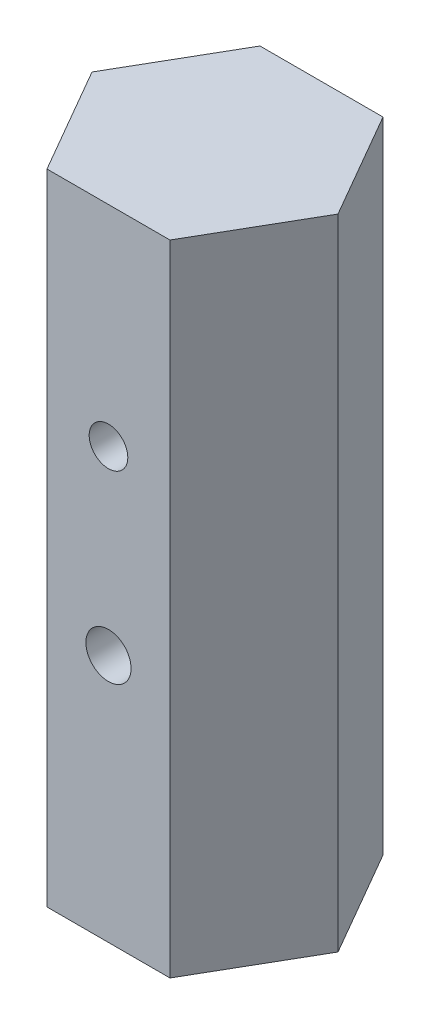
ISO-10303-21;
HEADER;
FILE_DESCRIPTION(('STEP AP214'),'2;1');
FILE_NAME('part.step','',(''),(''),'','','');
FILE_SCHEMA(('AUTOMOTIVE_DESIGN { 1 0 10303 214 1 1 1 1 }'));
ENDSEC;
DATA;
#1=APPLICATION_CONTEXT('core data for automotive mechanical design processes');
#2=APPLICATION_PROTOCOL_DEFINITION('international standard','automotive_design',2000,#1);
#3=PRODUCT_CONTEXT('',#1,'mechanical');
#4=PRODUCT('Part','Part','',(#3));
#5=PRODUCT_RELATED_PRODUCT_CATEGORY('part','',(#4));
#6=PRODUCT_DEFINITION_FORMATION('','',#4);
#7=PRODUCT_DEFINITION_CONTEXT('part definition',#1,'design');
#8=PRODUCT_DEFINITION('design','',#6,#7);
#9=PRODUCT_DEFINITION_SHAPE('','',#8);
#10=(LENGTH_UNIT() NAMED_UNIT(*) SI_UNIT(.MILLI.,.METRE.));
#11=(NAMED_UNIT(*) PLANE_ANGLE_UNIT() SI_UNIT($,.RADIAN.));
#12=(NAMED_UNIT(*) SI_UNIT($,.STERADIAN.) SOLID_ANGLE_UNIT());
#13=UNCERTAINTY_MEASURE_WITH_UNIT(LENGTH_MEASURE(1.E-05),#10,'distance_accuracy_value','');
#14=(GEOMETRIC_REPRESENTATION_CONTEXT(3) GLOBAL_UNCERTAINTY_ASSIGNED_CONTEXT((#13)) GLOBAL_UNIT_ASSIGNED_CONTEXT((#10,
#11,#12)) REPRESENTATION_CONTEXT('',''));
#15=CARTESIAN_POINT('',(0.,0.,0.));
#16=DIRECTION('',(0.,0.,1.));
#17=DIRECTION('',(1.,0.,0.));
#18=AXIS2_PLACEMENT_3D('',#15,#16,#17);
#19=CARTESIAN_POINT('',(-5.49926131403119,57.15,9.525));
#20=DIRECTION('',(0.,0.,-1.));
#21=DIRECTION('',(-1.,0.,0.));
#22=AXIS2_PLACEMENT_3D('',#19,#20,#21);
#23=PLANE('',#22);
#24=CARTESIAN_POINT('',(0.,38.4175,9.525));
#25=DIRECTION('',(0.,0.,1.));
#26=DIRECTION('',(1.,0.,0.));
#27=AXIS2_PLACEMENT_3D('',#24,#25,#26);
#28=CIRCLE('',#27,1.7272);
#29=CARTESIAN_POINT('',(1.72719999999999,38.4175,9.525));
#30=VERTEX_POINT('',#29);
#31=EDGE_CURVE('E164',#30,#30,#28,.T.);
#32=ORIENTED_EDGE('',*,*,#31,.F.);
#33=EDGE_LOOP('',(#32));
#34=FACE_BOUND('',#33,.T.);
#35=CARTESIAN_POINT('',(2.75785699295274E-13,22.225,9.525));
#36=DIRECTION('',(0.,0.,1.));
#37=DIRECTION('',(1.,0.,0.));
#38=AXIS2_PLACEMENT_3D('',#35,#36,#37);
#39=CIRCLE('',#38,2.01929999999999);
#40=CARTESIAN_POINT('',(2.01930000000026,22.225,9.525));
#41=VERTEX_POINT('',#40);
#42=EDGE_CURVE('E167',#41,#41,#39,.T.);
#43=ORIENTED_EDGE('',*,*,#42,.F.);
#44=EDGE_LOOP('',(#43));
#45=FACE_BOUND('',#44,.T.);
#46=DIRECTION('',(1.,0.,0.));
#47=VECTOR('',#46,1.);
#48=CARTESIAN_POINT('',(-5.49926131403119,0.,9.525));
#49=LINE('',#48,#47);
#50=CARTESIAN_POINT('',(-5.49926131403119,0.,9.525));
#51=VERTEX_POINT('',#50);
#52=CARTESIAN_POINT('',(5.49926131403118,0.,9.525));
#53=VERTEX_POINT('',#52);
#54=EDGE_CURVE('E121',#51,#53,#49,.T.);
#55=ORIENTED_EDGE('',*,*,#54,.T.);
#56=DIRECTION('',(0.,-1.,0.));
#57=VECTOR('',#56,1.);
#58=CARTESIAN_POINT('',(5.49926131403118,57.15,9.525));
#59=LINE('',#58,#57);
#60=CARTESIAN_POINT('',(5.49926131403118,57.15,9.525));
#61=VERTEX_POINT('',#60);
#62=EDGE_CURVE('E11',#61,#53,#59,.T.);
#63=ORIENTED_EDGE('',*,*,#62,.F.);
#64=DIRECTION('',(1.,0.,0.));
#65=VECTOR('',#64,1.);
#66=CARTESIAN_POINT('',(-5.49926131403119,57.15,9.525));
#67=LINE('',#66,#65);
#68=CARTESIAN_POINT('',(-5.49926131403119,57.15,9.525));
#69=VERTEX_POINT('',#68);
#70=EDGE_CURVE('E132',#69,#61,#67,.T.);
#71=ORIENTED_EDGE('',*,*,#70,.F.);
#72=DIRECTION('',(0.,-1.,0.));
#73=VECTOR('',#72,1.);
#74=CARTESIAN_POINT('',(-5.49926131403119,57.15,9.525));
#75=LINE('',#74,#73);
#76=EDGE_CURVE('E117',#69,#51,#75,.T.);
#77=ORIENTED_EDGE('',*,*,#76,.T.);
#78=EDGE_LOOP('',(#55,#63,#71,#77));
#79=FACE_BOUND('',#78,.T.);
#80=ADVANCED_FACE('F35',(#34,#45,#79),#23,.F.);
#81=CARTESIAN_POINT('',(5.49926131403118,57.15,9.525));
#82=DIRECTION('',(-0.866025403784439,0.,-0.5));
#83=DIRECTION('',(-0.5,0.,0.866025403784439));
#84=AXIS2_PLACEMENT_3D('',#81,#82,#83);
#85=PLANE('',#84);
#86=DIRECTION('',(0.5,0.,-0.866025403784438));
#87=VECTOR('',#86,1.);
#88=CARTESIAN_POINT('',(5.49926131403118,0.,9.525));
#89=LINE('',#88,#87);
#90=CARTESIAN_POINT('',(10.9985226280624,0.,0.));
#91=VERTEX_POINT('',#90);
#92=EDGE_CURVE('E124',#53,#91,#89,.T.);
#93=ORIENTED_EDGE('',*,*,#92,.T.);
#94=DIRECTION('',(0.,-1.,0.));
#95=VECTOR('',#94,1.);
#96=CARTESIAN_POINT('',(10.9985226280624,57.15,0.));
#97=LINE('',#96,#95);
#98=CARTESIAN_POINT('',(10.9985226280624,57.15,0.));
#99=VERTEX_POINT('',#98);
#100=EDGE_CURVE('E43',#99,#91,#97,.T.);
#101=ORIENTED_EDGE('',*,*,#100,.F.);
#102=DIRECTION('',(0.5,0.,-0.866025403784438));
#103=VECTOR('',#102,1.);
#104=CARTESIAN_POINT('',(5.49926131403118,57.15,9.525));
#105=LINE('',#104,#103);
#106=EDGE_CURVE('E89',#61,#99,#105,.T.);
#107=ORIENTED_EDGE('',*,*,#106,.F.);
#108=ORIENTED_EDGE('',*,*,#62,.T.);
#109=EDGE_LOOP('',(#93,#101,#107,#108));
#110=FACE_BOUND('',#109,.T.);
#111=ADVANCED_FACE('F156',(#110),#85,.F.);
#112=CARTESIAN_POINT('',(10.9985226280624,57.15,0.));
#113=DIRECTION('',(-0.866025403784439,0.,0.5));
#114=DIRECTION('',(0.5,0.,0.866025403784439));
#115=AXIS2_PLACEMENT_3D('',#112,#113,#114);
#116=PLANE('',#115);
#117=DIRECTION('',(-0.5,0.,-0.866025403784439));
#118=VECTOR('',#117,1.);
#119=CARTESIAN_POINT('',(10.9985226280624,0.,0.));
#120=LINE('',#119,#118);
#121=CARTESIAN_POINT('',(5.49926131403119,0.,-9.525));
#122=VERTEX_POINT('',#121);
#123=EDGE_CURVE('E127',#91,#122,#120,.T.);
#124=ORIENTED_EDGE('',*,*,#123,.T.);
#125=DIRECTION('',(0.,-1.,0.));
#126=VECTOR('',#125,1.);
#127=CARTESIAN_POINT('',(5.49926131403119,57.15,-9.525));
#128=LINE('',#127,#126);
#129=CARTESIAN_POINT('',(5.49926131403119,57.15,-9.525));
#130=VERTEX_POINT('',#129);
#131=EDGE_CURVE('E112',#130,#122,#128,.T.);
#132=ORIENTED_EDGE('',*,*,#131,.F.);
#133=DIRECTION('',(-0.5,0.,-0.866025403784439));
#134=VECTOR('',#133,1.);
#135=CARTESIAN_POINT('',(10.9985226280624,57.15,0.));
#136=LINE('',#135,#134);
#137=EDGE_CURVE('E103',#99,#130,#136,.T.);
#138=ORIENTED_EDGE('',*,*,#137,.F.);
#139=ORIENTED_EDGE('',*,*,#100,.T.);
#140=EDGE_LOOP('',(#124,#132,#138,#139));
#141=FACE_BOUND('',#140,.T.);
#142=ADVANCED_FACE('F138',(#141),#116,.F.);
#143=CARTESIAN_POINT('',(5.49926131403119,57.15,-9.525));
#144=DIRECTION('',(0.,0.,1.));
#145=DIRECTION('',(1.,0.,0.));
#146=AXIS2_PLACEMENT_3D('',#143,#144,#145);
#147=PLANE('',#146);
#148=DIRECTION('',(-1.,0.,0.));
#149=VECTOR('',#148,1.);
#150=CARTESIAN_POINT('',(5.49926131403119,0.,-9.525));
#151=LINE('',#150,#149);
#152=CARTESIAN_POINT('',(-5.49926131403118,0.,-9.52500000000001));
#153=VERTEX_POINT('',#152);
#154=EDGE_CURVE('E111',#122,#153,#151,.T.);
#155=ORIENTED_EDGE('',*,*,#154,.T.);
#156=DIRECTION('',(0.,-1.,0.));
#157=VECTOR('',#156,1.);
#158=CARTESIAN_POINT('',(-5.49926131403118,57.15,-9.52500000000001));
#159=LINE('',#158,#157);
#160=CARTESIAN_POINT('',(-5.49926131403118,57.15,-9.52500000000001));
#161=VERTEX_POINT('',#160);
#162=EDGE_CURVE('E108',#161,#153,#159,.T.);
#163=ORIENTED_EDGE('',*,*,#162,.F.);
#164=DIRECTION('',(-1.,0.,0.));
#165=VECTOR('',#164,1.);
#166=CARTESIAN_POINT('',(5.49926131403119,57.15,-9.525));
#167=LINE('',#166,#165);
#168=EDGE_CURVE('E97',#130,#161,#167,.T.);
#169=ORIENTED_EDGE('',*,*,#168,.F.);
#170=ORIENTED_EDGE('',*,*,#131,.T.);
#171=EDGE_LOOP('',(#155,#163,#169,#170));
#172=FACE_BOUND('',#171,.T.);
#173=ADVANCED_FACE('F109',(#172),#147,.F.);
#174=CARTESIAN_POINT('',(-5.49926131403118,57.15,-9.52500000000001));
#175=DIRECTION('',(0.866025403784438,0.,0.500000000000001));
#176=DIRECTION('',(0.500000000000001,0.,-0.866025403784438));
#177=AXIS2_PLACEMENT_3D('',#174,#175,#176);
#178=PLANE('',#177);
#179=DIRECTION('',(-0.500000000000001,0.,0.866025403784438));
#180=VECTOR('',#179,1.);
#181=CARTESIAN_POINT('',(-5.49926131403118,0.,-9.52500000000001));
#182=LINE('',#181,#180);
#183=CARTESIAN_POINT('',(-10.9985226280624,0.,0.));
#184=VERTEX_POINT('',#183);
#185=EDGE_CURVE('E75',#153,#184,#182,.T.);
#186=ORIENTED_EDGE('',*,*,#185,.T.);
#187=DIRECTION('',(0.,-1.,0.));
#188=VECTOR('',#187,1.);
#189=CARTESIAN_POINT('',(-10.9985226280624,57.15,0.));
#190=LINE('',#189,#188);
#191=CARTESIAN_POINT('',(-10.9985226280624,57.15,0.));
#192=VERTEX_POINT('',#191);
#193=EDGE_CURVE('E113',#192,#184,#190,.T.);
#194=ORIENTED_EDGE('',*,*,#193,.F.);
#195=DIRECTION('',(-0.500000000000001,0.,0.866025403784438));
#196=VECTOR('',#195,1.);
#197=CARTESIAN_POINT('',(-5.49926131403118,57.15,-9.52500000000001));
#198=LINE('',#197,#196);
#199=EDGE_CURVE('E101',#161,#192,#198,.T.);
#200=ORIENTED_EDGE('',*,*,#199,.F.);
#201=ORIENTED_EDGE('',*,*,#162,.T.);
#202=EDGE_LOOP('',(#186,#194,#200,#201));
#203=FACE_BOUND('',#202,.T.);
#204=ADVANCED_FACE('F115',(#203),#178,.F.);
#205=CARTESIAN_POINT('',(-10.9985226280624,57.15,0.));
#206=DIRECTION('',(0.866025403784439,0.,-0.499999999999999));
#207=DIRECTION('',(-0.499999999999999,0.,-0.866025403784439));
#208=AXIS2_PLACEMENT_3D('',#205,#206,#207);
#209=PLANE('',#208);
#210=DIRECTION('',(0.499999999999999,0.,0.866025403784439));
#211=VECTOR('',#210,1.);
#212=CARTESIAN_POINT('',(-10.9985226280624,0.,0.));
#213=LINE('',#212,#211);
#214=EDGE_CURVE('E81',#184,#51,#213,.T.);
#215=ORIENTED_EDGE('',*,*,#214,.T.);
#216=ORIENTED_EDGE('',*,*,#76,.F.);
#217=DIRECTION('',(0.499999999999999,0.,0.866025403784439));
#218=VECTOR('',#217,1.);
#219=CARTESIAN_POINT('',(-10.9985226280624,57.15,0.));
#220=LINE('',#219,#218);
#221=EDGE_CURVE('E51',#192,#69,#220,.T.);
#222=ORIENTED_EDGE('',*,*,#221,.F.);
#223=ORIENTED_EDGE('',*,*,#193,.T.);
#224=EDGE_LOOP('',(#215,#216,#222,#223));
#225=FACE_BOUND('',#224,.T.);
#226=ADVANCED_FACE('F145',(#225),#209,.F.);
#227=CARTESIAN_POINT('',(0.,57.15,0.));
#228=DIRECTION('',(0.,1.,0.));
#229=DIRECTION('',(0.,0.,1.));
#230=AXIS2_PLACEMENT_3D('',#227,#228,#229);
#231=PLANE('',#230);
#232=ORIENTED_EDGE('',*,*,#70,.T.);
#233=ORIENTED_EDGE('',*,*,#106,.T.);
#234=ORIENTED_EDGE('',*,*,#137,.T.);
#235=ORIENTED_EDGE('',*,*,#168,.T.);
#236=ORIENTED_EDGE('',*,*,#199,.T.);
#237=ORIENTED_EDGE('',*,*,#221,.T.);
#238=EDGE_LOOP('',(#232,#233,#234,#235,#236,#237));
#239=FACE_BOUND('',#238,.T.);
#240=ADVANCED_FACE('F99',(#239),#231,.T.);
#241=CARTESIAN_POINT('',(0.,0.,0.));
#242=DIRECTION('',(0.,1.,0.));
#243=DIRECTION('',(0.,0.,1.));
#244=AXIS2_PLACEMENT_3D('',#241,#242,#243);
#245=PLANE('',#244);
#246=CARTESIAN_POINT('',(0.,0.,0.));
#247=DIRECTION('',(0.,-1.,0.));
#248=DIRECTION('',(0.,0.,-1.));
#249=AXIS2_PLACEMENT_3D('',#246,#247,#248);
#250=CIRCLE('',#249,6.35);
#251=CARTESIAN_POINT('',(0.,0.,-6.35));
#252=VERTEX_POINT('',#251);
#253=EDGE_CURVE('E173',#252,#252,#250,.T.);
#254=ORIENTED_EDGE('',*,*,#253,.F.);
#255=EDGE_LOOP('',(#254));
#256=FACE_BOUND('',#255,.T.);
#257=ORIENTED_EDGE('',*,*,#54,.F.);
#258=ORIENTED_EDGE('',*,*,#214,.F.);
#259=ORIENTED_EDGE('',*,*,#185,.F.);
#260=ORIENTED_EDGE('',*,*,#154,.F.);
#261=ORIENTED_EDGE('',*,*,#123,.F.);
#262=ORIENTED_EDGE('',*,*,#92,.F.);
#263=EDGE_LOOP('',(#257,#258,#259,#260,#261,#262));
#264=FACE_BOUND('',#263,.T.);
#265=ADVANCED_FACE('F141',(#256,#264),#245,.F.);
#266=CARTESIAN_POINT('',(0.,45.72,0.));
#267=DIRECTION('',(0.,-1.,0.));
#268=DIRECTION('',(0.,0.,-1.));
#269=AXIS2_PLACEMENT_3D('',#266,#267,#268);
#270=CONICAL_SURFACE('',#269,6.34999999999981,1.02974425867664);
#271=CARTESIAN_POINT('',(0.,49.535464930825,0.));
#272=VERTEX_POINT('',#271);
#273=VERTEX_LOOP('',#272);
#274=FACE_BOUND('',#273,.T.);
#275=CARTESIAN_POINT('',(0.,45.72,0.));
#276=DIRECTION('',(0.,-1.,0.));
#277=DIRECTION('',(0.,0.,-1.));
#278=AXIS2_PLACEMENT_3D('',#275,#276,#277);
#279=CIRCLE('',#278,6.34999999999981);
#280=CARTESIAN_POINT('',(0.,45.72,-6.34999999999981));
#281=VERTEX_POINT('',#280);
#282=EDGE_CURVE('E125',#281,#281,#279,.T.);
#283=ORIENTED_EDGE('',*,*,#282,.T.);
#284=EDGE_LOOP('',(#283));
#285=FACE_BOUND('',#284,.T.);
#286=ADVANCED_FACE('F207',(#274,#285),#270,.F.);
#287=CARTESIAN_POINT('',(0.,0.,0.));
#288=DIRECTION('',(0.,-1.,0.));
#289=DIRECTION('',(0.,0.,-1.));
#290=AXIS2_PLACEMENT_3D('',#287,#288,#289);
#291=CYLINDRICAL_SURFACE('',#290,6.3499999999999);
#292=CARTESIAN_POINT('',(1.72719999999999,38.4175,6.11058754621835));
#293=CARTESIAN_POINT('',(1.7271978564907,38.5125715422346,6.11058912008888));
#294=CARTESIAN_POINT('',(1.71932362117438,38.6076654651833,6.11283056229475));
#295=CARTESIAN_POINT('',(1.68809764422043,38.7951018178512,6.12152599258622));
#296=CARTESIAN_POINT('',(1.66473854448726,38.8874429176755,6.12798198331815));
#297=CARTESIAN_POINT('',(1.60337166687234,39.0666348376233,6.14432243237157));
#298=CARTESIAN_POINT('',(1.56538505309186,39.1534933799274,6.15420193526068));
#299=CARTESIAN_POINT('',(1.47590829712548,39.3196195949981,6.17626986260033));
#300=CARTESIAN_POINT('',(1.42441695158622,39.3988865904521,6.18845849278121));
#301=CARTESIAN_POINT('',(1.30795943186265,39.5496421004825,6.21412675367232));
#302=CARTESIAN_POINT('',(1.24270483353424,39.620903835549,6.22763000482812));
#303=CARTESIAN_POINT('',(1.10119312105085,39.7516189207551,6.25420248796247));
#304=CARTESIAN_POINT('',(1.02493482854618,39.8110710046151,6.2672716732737));
#305=CARTESIAN_POINT('',(0.86200167480272,39.9174307650628,6.29176778579832));
#306=CARTESIAN_POINT('',(0.775173980701357,39.9641121038084,6.30316360442945));
#307=CARTESIAN_POINT('',(0.594540463619908,40.0421276699424,6.32275744505435));
#308=CARTESIAN_POINT('',(0.50073587008317,40.0734645939208,6.33095602887077));
#309=CARTESIAN_POINT('',(0.31117931879551,40.1191653137607,6.34306460700413));
#310=CARTESIAN_POINT('',(0.215526746216167,40.1339150858936,6.34707196690055));
#311=CARTESIAN_POINT('',(0.0230264429418282,40.1472380936873,6.3506873778913));
#312=CARTESIAN_POINT('',(-0.0738210770241474,40.1458141419804,6.35029619389843));
#313=CARTESIAN_POINT('',(-0.263272357630651,40.1270999926041,6.34522955038258));
#314=CARTESIAN_POINT('',(-0.355920799622251,40.1102269484153,6.34066673712747));
#315=CARTESIAN_POINT('',(-0.537018042107408,40.0617686442034,6.32790304112823));
#316=CARTESIAN_POINT('',(-0.62546659806736,40.030182528683,6.31970194683614));
#317=CARTESIAN_POINT('',(-0.79670698365311,39.952880782211,6.30041783155124));
#318=CARTESIAN_POINT('',(-0.879431759427297,39.9070240398697,6.28930621247757));
#319=CARTESIAN_POINT('',(-1.03615294730296,39.8025915157998,6.26539550585948));
#320=CARTESIAN_POINT('',(-1.1101475943784,39.7440131688401,6.25259607818389));
#321=CARTESIAN_POINT('',(-1.24979830408649,39.6135933445704,6.2262123895713));
#322=CARTESIAN_POINT('',(-1.31511299950739,39.5413883332239,6.21261611744628));
#323=CARTESIAN_POINT('',(-1.43279183442909,39.3869101126907,6.18653784670482));
#324=CARTESIAN_POINT('',(-1.48515511694274,39.3046362377916,6.17405592185897));
#325=CARTESIAN_POINT('',(-1.57571876127909,39.1315916781685,6.15156987696617));
#326=CARTESIAN_POINT('',(-1.61382277076757,39.0407682011204,6.14158276019793));
#327=CARTESIAN_POINT('',(-1.67410707533309,38.8536640478317,6.1254265473857));
#328=CARTESIAN_POINT('',(-1.69629150372238,38.757384795122,6.11925646035699));
#329=CARTESIAN_POINT('',(-1.72351095196236,38.5653034194076,6.11164502995632));
#330=CARTESIAN_POINT('',(-1.72905668153497,38.4695791681393,6.11006291551867));
#331=CARTESIAN_POINT('',(-1.72425134996382,38.2785703854609,6.11142077671334));
#332=CARTESIAN_POINT('',(-1.71390205874092,38.1832858062779,6.11436024886413));
#333=CARTESIAN_POINT('',(-1.67805145173567,37.997853121568,6.12429375669272));
#334=CARTESIAN_POINT('',(-1.65286041729675,37.9076401402243,6.13120469410945));
#335=CARTESIAN_POINT('',(-1.58839192103497,37.7327207343149,6.14822050776311));
#336=CARTESIAN_POINT('',(-1.54911256532187,37.6480150519038,6.15832581339665));
#337=CARTESIAN_POINT('',(-1.45655614729771,37.4843870955813,6.18087822705324));
#338=CARTESIAN_POINT('',(-1.40298099175044,37.4056402149133,6.19337337708975));
#339=CARTESIAN_POINT('',(-1.28372086657368,37.2580669707095,6.21918611412478));
#340=CARTESIAN_POINT('',(-1.2180335251851,37.1892425548617,6.23250386186079));
#341=CARTESIAN_POINT('',(-1.07404537777734,37.0613306772147,6.25894835245194));
#342=CARTESIAN_POINT('',(-0.995423398972692,37.0026002922106,6.27205716271603));
#343=CARTESIAN_POINT('',(-0.829141688030375,36.8991691332283,6.29619499285984));
#344=CARTESIAN_POINT('',(-0.741482437177393,36.8544676126476,6.3072241234056));
#345=CARTESIAN_POINT('',(-0.5602312525479,36.7807790480492,6.32588879813892));
#346=CARTESIAN_POINT('',(-0.466690095600544,36.7516738637154,6.33354977379829));
#347=CARTESIAN_POINT('',(-0.275804009606546,36.7096661258425,6.34472702197246));
#348=CARTESIAN_POINT('',(-0.178459965615999,36.6967598251856,6.3482442530047));
#349=CARTESIAN_POINT('',(0.0139385410653253,36.6877588126855,6.35069043046402));
#350=CARTESIAN_POINT('',(0.108967070508969,36.6911413012531,6.34976206669214));
#351=CARTESIAN_POINT('',(0.297049586800269,36.7134024850568,6.34374613530775));
#352=CARTESIAN_POINT('',(0.390103653038232,36.7322805560222,6.33865873525043));
#353=CARTESIAN_POINT('',(0.570940023672827,36.7846967103588,6.32492667256471));
#354=CARTESIAN_POINT('',(0.658756332017803,36.8181249360004,6.31630869490703));
#355=CARTESIAN_POINT('',(0.827583652709525,36.8985946387053,6.29641477998053));
#356=CARTESIAN_POINT('',(0.90859367937184,36.9456380831524,6.28513845862774));
#357=CARTESIAN_POINT('',(1.06392731354169,37.053511623391,6.26074396694678));
#358=CARTESIAN_POINT('',(1.13800547736597,37.1146855802781,6.24758364024707));
#359=CARTESIAN_POINT('',(1.27502152493155,37.2484365814187,6.22106908135278));
#360=CARTESIAN_POINT('',(1.33795643250798,37.3210166623039,6.20771479838331));
#361=CARTESIAN_POINT('',(1.45234474940204,37.4775394897127,6.1819672595577));
#362=CARTESIAN_POINT('',(1.50349880037899,37.5617062920351,6.16960339006549));
#363=CARTESIAN_POINT('',(1.59085918231706,37.7377716309953,6.14765883409732));
#364=CARTESIAN_POINT('',(1.62707491257842,37.8296652618974,6.13807639865101));
#365=CARTESIAN_POINT('',(1.67901017969678,38.0038797247129,6.12405323627291));
#366=CARTESIAN_POINT('',(1.6970378737693,38.0854738783566,6.11904545099267));
#367=CARTESIAN_POINT('',(1.72113297774581,38.2505397588024,6.11231211999924));
#368=CARTESIAN_POINT('',(1.72720188236046,38.3340112496398,6.1105861640962));
#369=CARTESIAN_POINT('',(1.72719999999999,38.4175,6.11058754621835));
#370=B_SPLINE_CURVE_WITH_KNOTS('',3,(#292,#293,#294,#295,#296,#297,#298,#299,#300,#301,#302,
#303,#304,#305,#306,#307,#308,#309,#310,#311,#312,#313,#314,#315,#316,#317,#318,#319,#320,#321,
#322,#323,#324,#325,#326,#327,#328,#329,#330,#331,#332,#333,#334,#335,#336,#337,#338,#339,#340,
#341,#342,#343,#344,#345,#346,#347,#348,#349,#350,#351,#352,#353,#354,#355,#356,#357,#358,#359,
#360,#361,#362,#363,#364,#365,#366,#367,#368,#369),.UNSPECIFIED.,.T.,.F.,(4,2,2,2,2,2,2,2,2,2,2,
2,2,2,2,2,2,2,2,2,2,2,2,2,2,2,2,2,2,2,2,2,2,2,2,2,2,2,4),(0.,0.284907483795322,
0.569950447023162,0.854582530633481,1.13923998530775,1.43059208606041,1.72197540994495,
2.01823016220199,2.31443283266958,2.60359035057115,2.89269758436284,3.17422149638734,
3.45576177977406,3.74017954811615,4.02465472083984,4.3182061474881,4.61177699306331,
4.9072971858953,5.2027406229633,5.48901787200055,5.775263246192,6.05572669321375,
6.33622785702083,6.62310984645769,6.91004807173363,7.20565699731886,7.50125018821927,
7.79457145824391,8.0878248648219,8.37173002674301,8.65562375153342,8.93741020430452,
9.21923739524774,9.50882250475629,9.79848484099477,10.0948495083034,10.3910274153004,
10.641255220995,10.8914517491176),.UNSPECIFIED.);
#371=CARTESIAN_POINT('',(1.72719999999999,38.4175,6.11058754621835));
#372=VERTEX_POINT('',#371);
#373=EDGE_CURVE('E170',#372,#372,#370,.T.);
#374=ORIENTED_EDGE('',*,*,#373,.T.);
#375=EDGE_LOOP('',(#374));
#376=FACE_BOUND('',#375,.T.);
#377=CARTESIAN_POINT('',(2.01930000000027,22.225,6.02037602729246));
#378=CARTESIAN_POINT('',(2.01929956026422,22.3353017250967,6.02037646749575));
#379=CARTESIAN_POINT('',(2.01023170571852,22.4456082857259,6.02344050950721));
#380=CARTESIAN_POINT('',(1.97430838772349,22.6629736808397,6.03530902098924));
#381=CARTESIAN_POINT('',(1.94744861646233,22.77003172222,6.04411488067128));
#382=CARTESIAN_POINT('',(1.87696408088353,22.9777192187769,6.06637097127123));
#383=CARTESIAN_POINT('',(1.83336979751874,23.0783599762718,6.07981275362814));
#384=CARTESIAN_POINT('',(1.73075607315422,23.2709285064053,6.10981426184535));
#385=CARTESIAN_POINT('',(1.6717337257603,23.3628546328992,6.1263745750212));
#386=CARTESIAN_POINT('',(1.5376901747677,23.5386551981777,6.16140806967097));
#387=CARTESIAN_POINT('',(1.4622141149636,23.6221740399197,6.17992573678187));
#388=CARTESIAN_POINT('',(1.29837827090183,23.7756081161683,6.21640959575278));
#389=CARTESIAN_POINT('',(1.21001662362671,23.8455213801421,6.23437570741263));
#390=CARTESIAN_POINT('',(1.02035088644209,23.9713402831311,6.26824262127274));
#391=CARTESIAN_POINT('',(0.918791412481137,24.0268780657333,6.284084955537));
#392=CARTESIAN_POINT('',(0.707183172504119,24.1199444365311,6.31139862636044));
#393=CARTESIAN_POINT('',(0.597136484441175,24.1574774167577,6.32287102876529));
#394=CARTESIAN_POINT('',(0.375402248765624,24.2122766669733,6.33983727415643));
#395=CARTESIAN_POINT('',(0.263878942516821,24.2301510722371,6.34551010625385));
#396=CARTESIAN_POINT('',(0.0392815408970634,24.2470543712911,6.35087102093266));
#397=CARTESIAN_POINT('',(-0.0737921835519057,24.2460876966394,6.35056051083952));
#398=CARTESIAN_POINT('',(-0.293994281712982,24.2257326376885,6.34411349745886));
#399=CARTESIAN_POINT('',(-0.401190714231311,24.2070038245043,6.33818559422282));
#400=CARTESIAN_POINT('',(-0.610831434637681,24.1527405572437,6.32142779530638));
#401=CARTESIAN_POINT('',(-0.713275408565866,24.1172049946005,6.31059757627314));
#402=CARTESIAN_POINT('',(-0.912004346737558,24.0299232919371,6.28497575343882));
#403=CARTESIAN_POINT('',(-1.00819641436086,23.9779802441299,6.27013636597917));
#404=CARTESIAN_POINT('',(-1.19070146265256,23.8595170754209,6.23805487553408));
#405=CARTESIAN_POINT('',(-1.27701186933626,23.7929931695748,6.22081214910638));
#406=CARTESIAN_POINT('',(-1.44123438704483,23.6438862951001,6.18487809655789));
#407=CARTESIAN_POINT('',(-1.51862453387901,23.5607349737483,6.16615636526476));
#408=CARTESIAN_POINT('',(-1.65852100152589,23.3824630142135,6.1300115845767));
#409=CARTESIAN_POINT('',(-1.72102543707038,23.2873408622598,6.11258869987181));
#410=CARTESIAN_POINT('',(-1.83001268235827,23.0863066993658,6.08085745214325));
#411=CARTESIAN_POINT('',(-1.8762952852456,22.9802794195421,6.06658875993144));
#412=CARTESIAN_POINT('',(-1.95018184235808,22.7613717564839,6.04324496426646));
#413=CARTESIAN_POINT('',(-1.97779279180679,22.6484939570467,6.03416791599164));
#414=CARTESIAN_POINT('',(-2.01253096607718,22.4241048064309,6.02266901235377));
#415=CARTESIAN_POINT('',(-2.02046009190239,22.3127308785873,6.01998680076806));
#416=CARTESIAN_POINT('',(-2.01786600313446,22.0902339056157,6.0208571210489));
#417=CARTESIAN_POINT('',(-2.00734576498777,21.9791108229147,6.02440864722304));
#418=CARTESIAN_POINT('',(-1.9688692858062,21.7637720096281,6.0370885682351));
#419=CARTESIAN_POINT('',(-1.9414507231139,21.659449010084,6.04604481661219));
#420=CARTESIAN_POINT('',(-1.87059075774167,21.4568982203009,6.06834083680366));
#421=CARTESIAN_POINT('',(-1.82714668118999,21.3586714504203,6.08168134009445));
#422=CARTESIAN_POINT('',(-1.72400857097087,21.1678950707924,6.11173074022288));
#423=CARTESIAN_POINT('',(-1.66387317193908,21.0755982505254,6.12852735715698));
#424=CARTESIAN_POINT('',(-1.52957075910602,20.9021141807413,6.1634178044255));
#425=CARTESIAN_POINT('',(-1.45539997200088,20.8209299288892,6.18151198278485));
#426=CARTESIAN_POINT('',(-1.29132738031909,20.6683605595703,6.21790333737366));
#427=CARTESIAN_POINT('',(-1.20088494497323,20.5975493211928,6.23617559208475));
#428=CARTESIAN_POINT('',(-1.00895693547157,20.4720825296585,6.2700867938515));
#429=CARTESIAN_POINT('',(-0.907471842898943,20.41742627235,6.28572585566807));
#430=CARTESIAN_POINT('',(-0.696937930748686,20.3263411395875,6.3125228340318));
#431=CARTESIAN_POINT('',(-0.587949267163495,20.2897830180833,6.32371240963142));
#432=CARTESIAN_POINT('',(-0.364950050599015,20.2356440297818,6.34048842994639));
#433=CARTESIAN_POINT('',(-0.250941143313473,20.2180569915427,6.3460766967694));
#434=CARTESIAN_POINT('',(-0.0264114188405347,20.2028749282135,6.35089535072716));
#435=CARTESIAN_POINT('',(0.0840484411291206,20.2044523479266,6.35038892662786));
#436=CARTESIAN_POINT('',(0.303057448395414,20.2255428025058,6.3437100579703));
#437=CARTESIAN_POINT('',(0.411606727351979,20.2450545965266,6.33753800540613));
#438=CARTESIAN_POINT('',(0.622284607581506,20.3009268754859,6.32030819275471));
#439=CARTESIAN_POINT('',(0.724479560357783,20.3370590447624,6.30931673016851));
#440=CARTESIAN_POINT('',(0.921403654910248,20.4249390024667,6.28358080960677));
#441=CARTESIAN_POINT('',(1.01613149162277,20.4766895129888,6.26883569748416));
#442=CARTESIAN_POINT('',(1.19901515900763,20.5964140963195,6.2364886029945));
#443=CARTESIAN_POINT('',(1.28682832959714,20.6648893433183,6.21880516492139));
#444=CARTESIAN_POINT('',(1.44999131137443,20.8152439566228,6.18280030619247));
#445=CARTESIAN_POINT('',(1.52533731548056,20.8971274022404,6.16447869271782));
#446=CARTESIAN_POINT('',(1.66406780373729,21.0753739573264,6.12851531343299));
#447=CARTESIAN_POINT('',(1.72694714602865,21.1721405852135,6.1109191258633));
#448=CARTESIAN_POINT('',(1.83548834162004,21.3754022236433,6.07920201396053));
#449=CARTESIAN_POINT('',(1.88115654407156,21.4818936286919,6.06507980875199));
#450=CARTESIAN_POINT('',(1.95100445412475,21.693388001829,6.04295675338623));
#451=CARTESIAN_POINT('',(1.97653786604664,21.797904625947,6.0345765259179));
#452=CARTESIAN_POINT('',(2.0106835731473,22.0099465140664,6.02328668548154));
#453=CARTESIAN_POINT('',(2.01930042868255,22.1174709592914,6.02037559815467));
#454=CARTESIAN_POINT('',(2.01930000000027,22.225,6.02037602729246));
#455=B_SPLINE_CURVE_WITH_KNOTS('',3,(#377,#378,#379,#380,#381,#382,#383,#384,#385,#386,#387,
#388,#389,#390,#391,#392,#393,#394,#395,#396,#397,#398,#399,#400,#401,#402,#403,#404,#405,#406,
#407,#408,#409,#410,#411,#412,#413,#414,#415,#416,#417,#418,#419,#420,#421,#422,#423,#424,#425,
#426,#427,#428,#429,#430,#431,#432,#433,#434,#435,#436,#437,#438,#439,#440,#441,#442,#443,#444,
#445,#446,#447,#448,#449,#450,#451,#452,#453,#454),.UNSPECIFIED.,.T.,.F.,(4,2,2,2,2,2,2,2,2,2,2,
2,2,2,2,2,2,2,2,2,2,2,2,2,2,2,2,2,2,2,2,2,2,2,2,2,2,2,4),(0.,0.330507715135782,
0.661095482676521,0.991083939035616,1.32113460466457,1.66183698568234,2.00258867488655,
2.35134936127616,2.70002492884316,3.03758123492368,3.37505814628261,3.70047464699384,
4.02591261504594,4.35541490460292,4.68500282889844,5.0287890534523,5.37261879523978,
5.72055382069323,6.06835842204179,6.40174099698631,6.73506979207677,7.05830409291582,
7.38159235010806,7.71441285953651,8.04732297259304,8.39459593143625,8.74185375136557,
9.08659454162665,9.43122315115948,9.76102495238165,10.0908039369633,10.416182115068,
10.7416170355672,11.0783581747155,11.415201955027,11.7637215492715,12.1121124492665,
12.4343989960784,12.7565986491137),.UNSPECIFIED.);
#456=CARTESIAN_POINT('',(2.01930000000027,22.225,6.02037602729246));
#457=VERTEX_POINT('',#456);
#458=EDGE_CURVE('E169',#457,#457,#455,.T.);
#459=ORIENTED_EDGE('',*,*,#458,.T.);
#460=EDGE_LOOP('',(#459));
#461=FACE_BOUND('',#460,.T.);
#462=ORIENTED_EDGE('',*,*,#282,.F.);
#463=EDGE_LOOP('',(#462));
#464=FACE_BOUND('',#463,.T.);
#465=ORIENTED_EDGE('',*,*,#253,.T.);
#466=EDGE_LOOP('',(#465));
#467=FACE_BOUND('',#466,.T.);
#468=ADVANCED_FACE('F194',(#376,#461,#464,#467),#291,.F.);
#469=CARTESIAN_POINT('',(2.75785699295274E-13,22.225,9.525));
#470=DIRECTION('',(0.,0.,1.));
#471=DIRECTION('',(1.,0.,0.));
#472=AXIS2_PLACEMENT_3D('',#469,#470,#471);
#473=CYLINDRICAL_SURFACE('',#472,2.01929999999999);
#474=ORIENTED_EDGE('',*,*,#458,.F.);
#475=EDGE_LOOP('',(#474));
#476=FACE_BOUND('',#475,.T.);
#477=ORIENTED_EDGE('',*,*,#42,.T.);
#478=EDGE_LOOP('',(#477));
#479=FACE_BOUND('',#478,.T.);
#480=ADVANCED_FACE('F190',(#476,#479),#473,.F.);
#481=CARTESIAN_POINT('',(0.,38.4175,9.525));
#482=DIRECTION('',(0.,0.,1.));
#483=DIRECTION('',(1.,0.,0.));
#484=AXIS2_PLACEMENT_3D('',#481,#482,#483);
#485=CYLINDRICAL_SURFACE('',#484,1.7272);
#486=ORIENTED_EDGE('',*,*,#373,.F.);
#487=EDGE_LOOP('',(#486));
#488=FACE_BOUND('',#487,.T.);
#489=ORIENTED_EDGE('',*,*,#31,.T.);
#490=EDGE_LOOP('',(#489));
#491=FACE_BOUND('',#490,.T.);
#492=ADVANCED_FACE('F193',(#488,#491),#485,.F.);
#493=CLOSED_SHELL('',(#80,#111,#142,#173,#204,#226,#240,#265,#286,#468,#480,#492));
#494=MANIFOLD_SOLID_BREP('B2',#493);
#495=ADVANCED_BREP_SHAPE_REPRESENTATION('',(#18,#494),#14);
#496=SHAPE_DEFINITION_REPRESENTATION(#9,#495);
ENDSEC;
END-ISO-10303-21;
